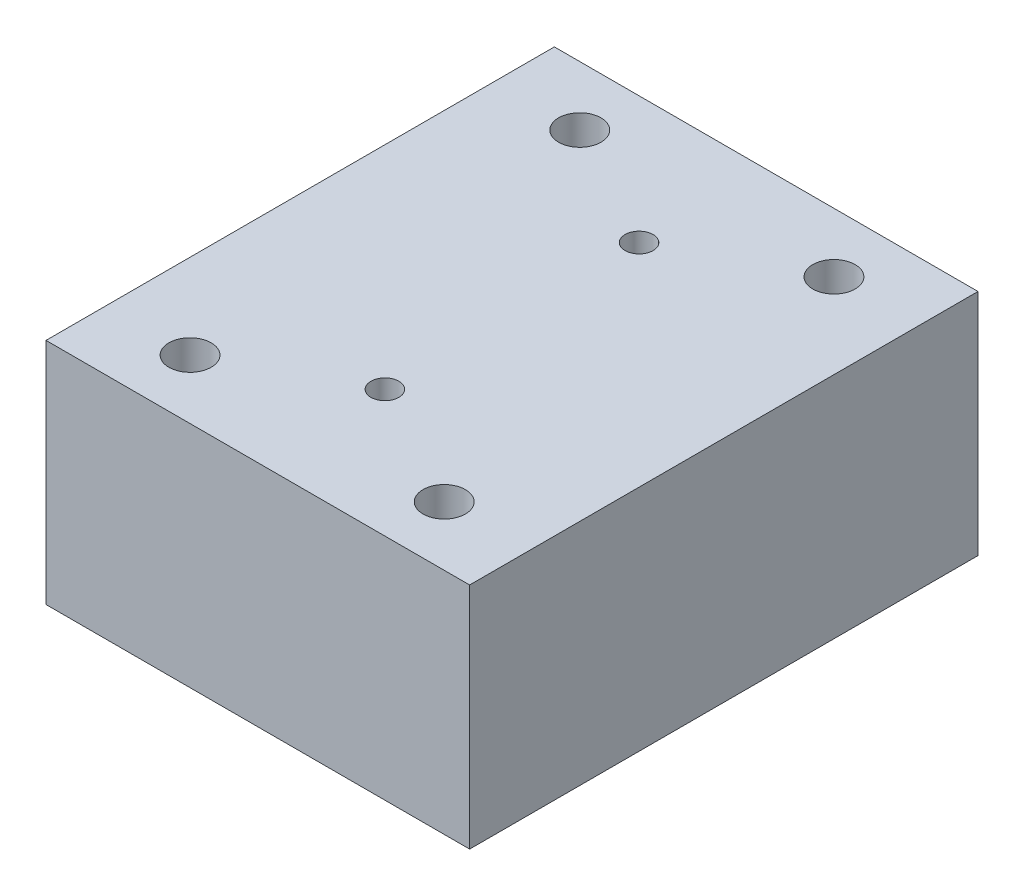
ISO-10303-21;
HEADER;
FILE_DESCRIPTION(('STEP AP214'),'2;1');
FILE_NAME('part.step','',(''),(''),'','','');
FILE_SCHEMA(('AUTOMOTIVE_DESIGN { 1 0 10303 214 1 1 1 1 }'));
ENDSEC;
DATA;
#1=APPLICATION_CONTEXT('core data for automotive mechanical design processes');
#2=APPLICATION_PROTOCOL_DEFINITION('international standard','automotive_design',2000,#1);
#3=PRODUCT_CONTEXT('',#1,'mechanical');
#4=PRODUCT('Part','Part','',(#3));
#5=PRODUCT_RELATED_PRODUCT_CATEGORY('part','',(#4));
#6=PRODUCT_DEFINITION_FORMATION('','',#4);
#7=PRODUCT_DEFINITION_CONTEXT('part definition',#1,'design');
#8=PRODUCT_DEFINITION('design','',#6,#7);
#9=PRODUCT_DEFINITION_SHAPE('','',#8);
#10=(LENGTH_UNIT() NAMED_UNIT(*) SI_UNIT(.MILLI.,.METRE.));
#11=(NAMED_UNIT(*) PLANE_ANGLE_UNIT() SI_UNIT($,.RADIAN.));
#12=(NAMED_UNIT(*) SI_UNIT($,.STERADIAN.) SOLID_ANGLE_UNIT());
#13=UNCERTAINTY_MEASURE_WITH_UNIT(LENGTH_MEASURE(1.E-05),#10,'distance_accuracy_value','');
#14=(GEOMETRIC_REPRESENTATION_CONTEXT(3) GLOBAL_UNCERTAINTY_ASSIGNED_CONTEXT((#13)) GLOBAL_UNIT_ASSIGNED_CONTEXT((#10,
#11,#12)) REPRESENTATION_CONTEXT('',''));
#15=CARTESIAN_POINT('',(0.,0.,0.));
#16=DIRECTION('',(0.,0.,1.));
#17=DIRECTION('',(1.,0.,0.));
#18=AXIS2_PLACEMENT_3D('',#15,#16,#17);
#19=CARTESIAN_POINT('',(25.,13.5,60.));
#20=DIRECTION('',(-1.,0.,0.));
#21=DIRECTION('',(0.,0.,1.));
#22=AXIS2_PLACEMENT_3D('',#19,#20,#21);
#23=PLANE('',#22);
#24=DIRECTION('',(0.,1.,0.));
#25=VECTOR('',#24,1.);
#26=CARTESIAN_POINT('',(25.,13.5,0.));
#27=LINE('',#26,#25);
#28=CARTESIAN_POINT('',(25.,-13.5,0.));
#29=VERTEX_POINT('',#28);
#30=CARTESIAN_POINT('',(25.,13.5,0.));
#31=VERTEX_POINT('',#30);
#32=EDGE_CURVE('E95',#29,#31,#27,.T.);
#33=ORIENTED_EDGE('',*,*,#32,.T.);
#34=DIRECTION('',(0.,0.,-1.));
#35=VECTOR('',#34,1.);
#36=CARTESIAN_POINT('',(25.,13.5,60.));
#37=LINE('',#36,#35);
#38=CARTESIAN_POINT('',(25.,13.5,60.));
#39=VERTEX_POINT('',#38);
#40=EDGE_CURVE('E11',#39,#31,#37,.T.);
#41=ORIENTED_EDGE('',*,*,#40,.F.);
#42=DIRECTION('',(0.,1.,0.));
#43=VECTOR('',#42,1.);
#44=CARTESIAN_POINT('',(25.,13.5,60.));
#45=LINE('',#44,#43);
#46=CARTESIAN_POINT('',(25.,-13.5,60.));
#47=VERTEX_POINT('',#46);
#48=EDGE_CURVE('E83',#47,#39,#45,.T.);
#49=ORIENTED_EDGE('',*,*,#48,.F.);
#50=DIRECTION('',(0.,0.,-1.));
#51=VECTOR('',#50,1.);
#52=CARTESIAN_POINT('',(25.,-13.5,60.));
#53=LINE('',#52,#51);
#54=EDGE_CURVE('E91',#47,#29,#53,.T.);
#55=ORIENTED_EDGE('',*,*,#54,.T.);
#56=EDGE_LOOP('',(#33,#41,#49,#55));
#57=FACE_BOUND('',#56,.T.);
#58=ADVANCED_FACE('F32',(#57),#23,.F.);
#59=CARTESIAN_POINT('',(-25.,13.5,60.));
#60=DIRECTION('',(0.,-1.,0.));
#61=DIRECTION('',(0.,0.,-1.));
#62=AXIS2_PLACEMENT_3D('',#59,#60,#61);
#63=PLANE('',#62);
#64=CARTESIAN_POINT('',(0.,13.5,45.));
#65=DIRECTION('',(0.,1.,0.));
#66=DIRECTION('',(0.,0.,1.));
#67=AXIS2_PLACEMENT_3D('',#64,#65,#66);
#68=CIRCLE('',#67,1.65);
#69=CARTESIAN_POINT('',(0.,13.5,46.65));
#70=VERTEX_POINT('',#69);
#71=EDGE_CURVE('E139',#70,#70,#68,.T.);
#72=ORIENTED_EDGE('',*,*,#71,.F.);
#73=EDGE_LOOP('',(#72));
#74=FACE_BOUND('',#73,.T.);
#75=CARTESIAN_POINT('',(0.,13.5,15.));
#76=DIRECTION('',(0.,1.,0.));
#77=DIRECTION('',(0.,0.,1.));
#78=AXIS2_PLACEMENT_3D('',#75,#76,#77);
#79=CIRCLE('',#78,1.65);
#80=CARTESIAN_POINT('',(0.,13.5,16.65));
#81=VERTEX_POINT('',#80);
#82=EDGE_CURVE('E133',#81,#81,#79,.T.);
#83=ORIENTED_EDGE('',*,*,#82,.F.);
#84=EDGE_LOOP('',(#83));
#85=FACE_BOUND('',#84,.T.);
#86=CARTESIAN_POINT('',(15.,13.5,53.));
#87=DIRECTION('',(0.,1.,0.));
#88=DIRECTION('',(-1.,0.,0.));
#89=AXIS2_PLACEMENT_3D('',#86,#87,#88);
#90=CIRCLE('',#89,2.5);
#91=CARTESIAN_POINT('',(12.5,13.5,53.));
#92=VERTEX_POINT('',#91);
#93=EDGE_CURVE('E127',#92,#92,#90,.T.);
#94=ORIENTED_EDGE('',*,*,#93,.F.);
#95=EDGE_LOOP('',(#94));
#96=FACE_BOUND('',#95,.T.);
#97=CARTESIAN_POINT('',(15.,13.5,7.));
#98=DIRECTION('',(0.,1.,0.));
#99=DIRECTION('',(-1.,0.,0.));
#100=AXIS2_PLACEMENT_3D('',#97,#98,#99);
#101=CIRCLE('',#100,2.5);
#102=CARTESIAN_POINT('',(12.5,13.5,7.));
#103=VERTEX_POINT('',#102);
#104=EDGE_CURVE('E121',#103,#103,#101,.T.);
#105=ORIENTED_EDGE('',*,*,#104,.F.);
#106=EDGE_LOOP('',(#105));
#107=FACE_BOUND('',#106,.T.);
#108=CARTESIAN_POINT('',(-15.,13.5,53.));
#109=DIRECTION('',(0.,1.,0.));
#110=DIRECTION('',(-1.,0.,0.));
#111=AXIS2_PLACEMENT_3D('',#108,#109,#110);
#112=CIRCLE('',#111,2.5);
#113=CARTESIAN_POINT('',(-17.5,13.5,53.));
#114=VERTEX_POINT('',#113);
#115=EDGE_CURVE('E115',#114,#114,#112,.T.);
#116=ORIENTED_EDGE('',*,*,#115,.F.);
#117=EDGE_LOOP('',(#116));
#118=FACE_BOUND('',#117,.T.);
#119=CARTESIAN_POINT('',(-15.,13.5,7.));
#120=DIRECTION('',(0.,1.,0.));
#121=DIRECTION('',(-1.,0.,0.));
#122=AXIS2_PLACEMENT_3D('',#119,#120,#121);
#123=CIRCLE('',#122,2.5);
#124=CARTESIAN_POINT('',(-17.5,13.5,7.));
#125=VERTEX_POINT('',#124);
#126=EDGE_CURVE('E109',#125,#125,#123,.T.);
#127=ORIENTED_EDGE('',*,*,#126,.F.);
#128=EDGE_LOOP('',(#127));
#129=FACE_BOUND('',#128,.T.);
#130=DIRECTION('',(-1.,0.,0.));
#131=VECTOR('',#130,1.);
#132=CARTESIAN_POINT('',(-25.,13.5,0.));
#133=LINE('',#132,#131);
#134=CARTESIAN_POINT('',(-25.,13.5,0.));
#135=VERTEX_POINT('',#134);
#136=EDGE_CURVE('E87',#31,#135,#133,.T.);
#137=ORIENTED_EDGE('',*,*,#136,.T.);
#138=DIRECTION('',(0.,0.,-1.));
#139=VECTOR('',#138,1.);
#140=CARTESIAN_POINT('',(-25.,13.5,60.));
#141=LINE('',#140,#139);
#142=CARTESIAN_POINT('',(-25.,13.5,60.));
#143=VERTEX_POINT('',#142);
#144=EDGE_CURVE('E40',#143,#135,#141,.T.);
#145=ORIENTED_EDGE('',*,*,#144,.F.);
#146=DIRECTION('',(-1.,0.,0.));
#147=VECTOR('',#146,1.);
#148=CARTESIAN_POINT('',(-25.,13.5,60.));
#149=LINE('',#148,#147);
#150=EDGE_CURVE('E78',#39,#143,#149,.T.);
#151=ORIENTED_EDGE('',*,*,#150,.F.);
#152=ORIENTED_EDGE('',*,*,#40,.T.);
#153=EDGE_LOOP('',(#137,#145,#151,#152));
#154=FACE_BOUND('',#153,.T.);
#155=ADVANCED_FACE('F86',(#74,#85,#96,#107,#118,#129,#154),#63,.F.);
#156=CARTESIAN_POINT('',(-25.,13.5,60.));
#157=DIRECTION('',(1.,0.,0.));
#158=DIRECTION('',(0.,0.,-1.));
#159=AXIS2_PLACEMENT_3D('',#156,#157,#158);
#160=PLANE('',#159);
#161=DIRECTION('',(0.,-1.,0.));
#162=VECTOR('',#161,1.);
#163=CARTESIAN_POINT('',(-25.,13.5,0.));
#164=LINE('',#163,#162);
#165=CARTESIAN_POINT('',(-25.,-13.5,0.));
#166=VERTEX_POINT('',#165);
#167=EDGE_CURVE('E65',#135,#166,#164,.T.);
#168=ORIENTED_EDGE('',*,*,#167,.T.);
#169=DIRECTION('',(0.,0.,-1.));
#170=VECTOR('',#169,1.);
#171=CARTESIAN_POINT('',(-25.,-13.5,60.));
#172=LINE('',#171,#170);
#173=CARTESIAN_POINT('',(-25.,-13.5,60.));
#174=VERTEX_POINT('',#173);
#175=EDGE_CURVE('E88',#174,#166,#172,.T.);
#176=ORIENTED_EDGE('',*,*,#175,.F.);
#177=DIRECTION('',(0.,-1.,0.));
#178=VECTOR('',#177,1.);
#179=CARTESIAN_POINT('',(-25.,13.5,60.));
#180=LINE('',#179,#178);
#181=EDGE_CURVE('E81',#143,#174,#180,.T.);
#182=ORIENTED_EDGE('',*,*,#181,.F.);
#183=ORIENTED_EDGE('',*,*,#144,.T.);
#184=EDGE_LOOP('',(#168,#176,#182,#183));
#185=FACE_BOUND('',#184,.T.);
#186=ADVANCED_FACE('F89',(#185),#160,.F.);
#187=CARTESIAN_POINT('',(-25.,-13.5,60.));
#188=DIRECTION('',(0.,1.,0.));
#189=DIRECTION('',(0.,0.,1.));
#190=AXIS2_PLACEMENT_3D('',#187,#188,#189);
#191=PLANE('',#190);
#192=CARTESIAN_POINT('',(0.,-13.5,45.));
#193=DIRECTION('',(0.,1.,0.));
#194=DIRECTION('',(0.,0.,1.));
#195=AXIS2_PLACEMENT_3D('',#192,#193,#194);
#196=CIRCLE('',#195,1.65);
#197=CARTESIAN_POINT('',(0.,-13.5,46.65));
#198=VERTEX_POINT('',#197);
#199=EDGE_CURVE('E136',#198,#198,#196,.T.);
#200=ORIENTED_EDGE('',*,*,#199,.T.);
#201=EDGE_LOOP('',(#200));
#202=FACE_BOUND('',#201,.T.);
#203=CARTESIAN_POINT('',(0.,-13.5,15.));
#204=DIRECTION('',(0.,1.,0.));
#205=DIRECTION('',(0.,0.,1.));
#206=AXIS2_PLACEMENT_3D('',#203,#204,#205);
#207=CIRCLE('',#206,1.65);
#208=CARTESIAN_POINT('',(0.,-13.5,16.65));
#209=VERTEX_POINT('',#208);
#210=EDGE_CURVE('E130',#209,#209,#207,.T.);
#211=ORIENTED_EDGE('',*,*,#210,.T.);
#212=EDGE_LOOP('',(#211));
#213=FACE_BOUND('',#212,.T.);
#214=CARTESIAN_POINT('',(15.,-13.5,53.));
#215=DIRECTION('',(0.,1.,0.));
#216=DIRECTION('',(-1.,0.,0.));
#217=AXIS2_PLACEMENT_3D('',#214,#215,#216);
#218=CIRCLE('',#217,2.5);
#219=CARTESIAN_POINT('',(12.5,-13.5,53.));
#220=VERTEX_POINT('',#219);
#221=EDGE_CURVE('E124',#220,#220,#218,.T.);
#222=ORIENTED_EDGE('',*,*,#221,.T.);
#223=EDGE_LOOP('',(#222));
#224=FACE_BOUND('',#223,.T.);
#225=CARTESIAN_POINT('',(15.,-13.5,7.));
#226=DIRECTION('',(0.,1.,0.));
#227=DIRECTION('',(-1.,0.,0.));
#228=AXIS2_PLACEMENT_3D('',#225,#226,#227);
#229=CIRCLE('',#228,2.5);
#230=CARTESIAN_POINT('',(12.5,-13.5,7.));
#231=VERTEX_POINT('',#230);
#232=EDGE_CURVE('E118',#231,#231,#229,.T.);
#233=ORIENTED_EDGE('',*,*,#232,.T.);
#234=EDGE_LOOP('',(#233));
#235=FACE_BOUND('',#234,.T.);
#236=CARTESIAN_POINT('',(-15.,-13.5,53.));
#237=DIRECTION('',(0.,1.,0.));
#238=DIRECTION('',(-1.,0.,0.));
#239=AXIS2_PLACEMENT_3D('',#236,#237,#238);
#240=CIRCLE('',#239,2.5);
#241=CARTESIAN_POINT('',(-17.5,-13.5,53.));
#242=VERTEX_POINT('',#241);
#243=EDGE_CURVE('E112',#242,#242,#240,.T.);
#244=ORIENTED_EDGE('',*,*,#243,.T.);
#245=EDGE_LOOP('',(#244));
#246=FACE_BOUND('',#245,.T.);
#247=CARTESIAN_POINT('',(-15.,-13.5,7.));
#248=DIRECTION('',(0.,1.,0.));
#249=DIRECTION('',(-1.,0.,0.));
#250=AXIS2_PLACEMENT_3D('',#247,#248,#249);
#251=CIRCLE('',#250,2.5);
#252=CARTESIAN_POINT('',(-17.5,-13.5,7.));
#253=VERTEX_POINT('',#252);
#254=EDGE_CURVE('E98',#253,#253,#251,.T.);
#255=ORIENTED_EDGE('',*,*,#254,.T.);
#256=EDGE_LOOP('',(#255));
#257=FACE_BOUND('',#256,.T.);
#258=DIRECTION('',(1.,0.,0.));
#259=VECTOR('',#258,1.);
#260=CARTESIAN_POINT('',(-25.,-13.5,0.));
#261=LINE('',#260,#259);
#262=EDGE_CURVE('E71',#166,#29,#261,.T.);
#263=ORIENTED_EDGE('',*,*,#262,.T.);
#264=ORIENTED_EDGE('',*,*,#54,.F.);
#265=DIRECTION('',(1.,0.,0.));
#266=VECTOR('',#265,1.);
#267=CARTESIAN_POINT('',(-25.,-13.5,60.));
#268=LINE('',#267,#266);
#269=EDGE_CURVE('E48',#174,#47,#268,.T.);
#270=ORIENTED_EDGE('',*,*,#269,.F.);
#271=ORIENTED_EDGE('',*,*,#175,.T.);
#272=EDGE_LOOP('',(#263,#264,#270,#271));
#273=FACE_BOUND('',#272,.T.);
#274=ADVANCED_FACE('F103',(#202,#213,#224,#235,#246,#257,#273),#191,.F.);
#275=CARTESIAN_POINT('',(0.,0.,60.));
#276=DIRECTION('',(0.,0.,1.));
#277=DIRECTION('',(1.,0.,0.));
#278=AXIS2_PLACEMENT_3D('',#275,#276,#277);
#279=PLANE('',#278);
#280=ORIENTED_EDGE('',*,*,#48,.T.);
#281=ORIENTED_EDGE('',*,*,#150,.T.);
#282=ORIENTED_EDGE('',*,*,#181,.T.);
#283=ORIENTED_EDGE('',*,*,#269,.T.);
#284=EDGE_LOOP('',(#280,#281,#282,#283));
#285=FACE_BOUND('',#284,.T.);
#286=ADVANCED_FACE('F79',(#285),#279,.T.);
#287=CARTESIAN_POINT('',(0.,0.,0.));
#288=DIRECTION('',(0.,0.,1.));
#289=DIRECTION('',(1.,0.,0.));
#290=AXIS2_PLACEMENT_3D('',#287,#288,#289);
#291=PLANE('',#290);
#292=ORIENTED_EDGE('',*,*,#32,.F.);
#293=ORIENTED_EDGE('',*,*,#262,.F.);
#294=ORIENTED_EDGE('',*,*,#167,.F.);
#295=ORIENTED_EDGE('',*,*,#136,.F.);
#296=EDGE_LOOP('',(#292,#293,#294,#295));
#297=FACE_BOUND('',#296,.T.);
#298=ADVANCED_FACE('F106',(#297),#291,.F.);
#299=CARTESIAN_POINT('',(-15.,-13.5,7.));
#300=DIRECTION('',(0.,1.,0.));
#301=DIRECTION('',(-1.,0.,0.));
#302=AXIS2_PLACEMENT_3D('',#299,#300,#301);
#303=CYLINDRICAL_SURFACE('',#302,2.5);
#304=ORIENTED_EDGE('',*,*,#254,.F.);
#305=EDGE_LOOP('',(#304));
#306=FACE_BOUND('',#305,.T.);
#307=ORIENTED_EDGE('',*,*,#126,.T.);
#308=EDGE_LOOP('',(#307));
#309=FACE_BOUND('',#308,.T.);
#310=ADVANCED_FACE('F166',(#306,#309),#303,.F.);
#311=CARTESIAN_POINT('',(-15.,-13.5,53.));
#312=DIRECTION('',(0.,1.,0.));
#313=DIRECTION('',(-1.,0.,0.));
#314=AXIS2_PLACEMENT_3D('',#311,#312,#313);
#315=CYLINDRICAL_SURFACE('',#314,2.5);
#316=ORIENTED_EDGE('',*,*,#243,.F.);
#317=EDGE_LOOP('',(#316));
#318=FACE_BOUND('',#317,.T.);
#319=ORIENTED_EDGE('',*,*,#115,.T.);
#320=EDGE_LOOP('',(#319));
#321=FACE_BOUND('',#320,.T.);
#322=ADVANCED_FACE('F168',(#318,#321),#315,.F.);
#323=CARTESIAN_POINT('',(15.,-13.5,7.));
#324=DIRECTION('',(0.,1.,0.));
#325=DIRECTION('',(-1.,0.,0.));
#326=AXIS2_PLACEMENT_3D('',#323,#324,#325);
#327=CYLINDRICAL_SURFACE('',#326,2.5);
#328=ORIENTED_EDGE('',*,*,#232,.F.);
#329=EDGE_LOOP('',(#328));
#330=FACE_BOUND('',#329,.T.);
#331=ORIENTED_EDGE('',*,*,#104,.T.);
#332=EDGE_LOOP('',(#331));
#333=FACE_BOUND('',#332,.T.);
#334=ADVANCED_FACE('F175',(#330,#333),#327,.F.);
#335=CARTESIAN_POINT('',(15.,-13.5,53.));
#336=DIRECTION('',(0.,1.,0.));
#337=DIRECTION('',(-1.,0.,0.));
#338=AXIS2_PLACEMENT_3D('',#335,#336,#337);
#339=CYLINDRICAL_SURFACE('',#338,2.5);
#340=ORIENTED_EDGE('',*,*,#221,.F.);
#341=EDGE_LOOP('',(#340));
#342=FACE_BOUND('',#341,.T.);
#343=ORIENTED_EDGE('',*,*,#93,.T.);
#344=EDGE_LOOP('',(#343));
#345=FACE_BOUND('',#344,.T.);
#346=ADVANCED_FACE('F229',(#342,#345),#339,.F.);
#347=CARTESIAN_POINT('',(0.,-13.5,15.));
#348=DIRECTION('',(0.,1.,0.));
#349=DIRECTION('',(0.,0.,1.));
#350=AXIS2_PLACEMENT_3D('',#347,#348,#349);
#351=CYLINDRICAL_SURFACE('',#350,1.65);
#352=ORIENTED_EDGE('',*,*,#210,.F.);
#353=EDGE_LOOP('',(#352));
#354=FACE_BOUND('',#353,.T.);
#355=ORIENTED_EDGE('',*,*,#82,.T.);
#356=EDGE_LOOP('',(#355));
#357=FACE_BOUND('',#356,.T.);
#358=ADVANCED_FACE('F150',(#354,#357),#351,.F.);
#359=CARTESIAN_POINT('',(0.,-13.5,45.));
#360=DIRECTION('',(0.,1.,0.));
#361=DIRECTION('',(0.,0.,1.));
#362=AXIS2_PLACEMENT_3D('',#359,#360,#361);
#363=CYLINDRICAL_SURFACE('',#362,1.65);
#364=ORIENTED_EDGE('',*,*,#199,.F.);
#365=EDGE_LOOP('',(#364));
#366=FACE_BOUND('',#365,.T.);
#367=ORIENTED_EDGE('',*,*,#71,.T.);
#368=EDGE_LOOP('',(#367));
#369=FACE_BOUND('',#368,.T.);
#370=ADVANCED_FACE('F147',(#366,#369),#363,.F.);
#371=CLOSED_SHELL('',(#58,#155,#186,#274,#286,#298,#310,#322,#334,#346,#358,#370));
#372=MANIFOLD_SOLID_BREP('B2',#371);
#373=ADVANCED_BREP_SHAPE_REPRESENTATION('',(#18,#372),#14);
#374=SHAPE_DEFINITION_REPRESENTATION(#9,#373);
ENDSEC;
END-ISO-10303-21;
